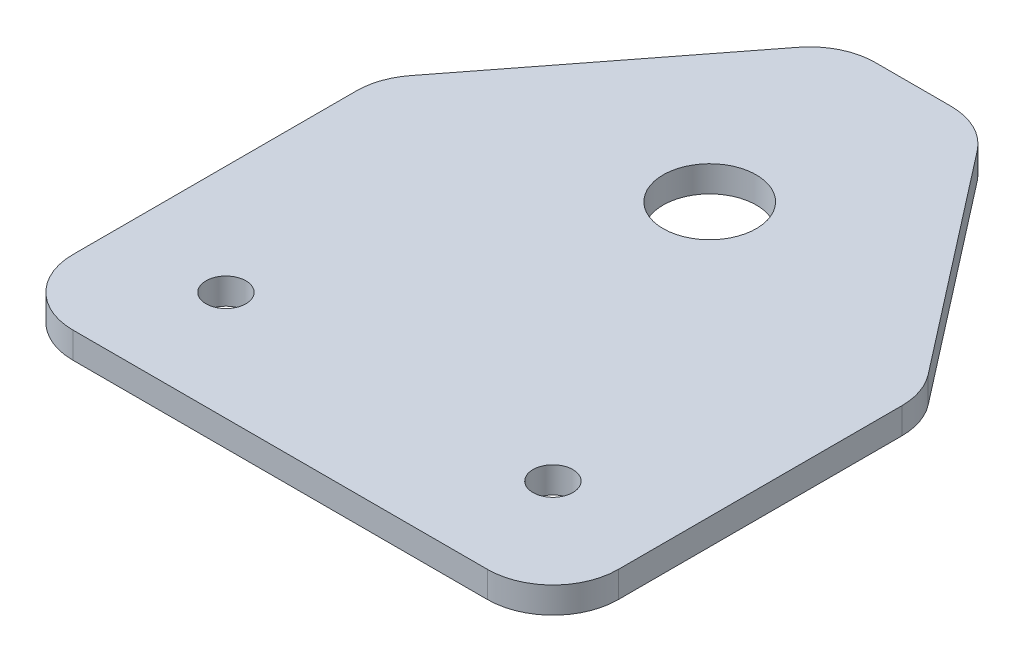
ISO-10303-21;
HEADER;
FILE_DESCRIPTION(('STEP AP214'),'2;1');
FILE_NAME('part.step','',(''),(''),'','','');
FILE_SCHEMA(('AUTOMOTIVE_DESIGN { 1 0 10303 214 1 1 1 1 }'));
ENDSEC;
DATA;
#1=APPLICATION_CONTEXT('core data for automotive mechanical design processes');
#2=APPLICATION_PROTOCOL_DEFINITION('international standard','automotive_design',2000,#1);
#3=PRODUCT_CONTEXT('',#1,'mechanical');
#4=PRODUCT('Part','Part','',(#3));
#5=PRODUCT_RELATED_PRODUCT_CATEGORY('part','',(#4));
#6=PRODUCT_DEFINITION_FORMATION('','',#4);
#7=PRODUCT_DEFINITION_CONTEXT('part definition',#1,'design');
#8=PRODUCT_DEFINITION('design','',#6,#7);
#9=PRODUCT_DEFINITION_SHAPE('','',#8);
#10=(LENGTH_UNIT() NAMED_UNIT(*) SI_UNIT(.MILLI.,.METRE.));
#11=(NAMED_UNIT(*) PLANE_ANGLE_UNIT() SI_UNIT($,.RADIAN.));
#12=(NAMED_UNIT(*) SI_UNIT($,.STERADIAN.) SOLID_ANGLE_UNIT());
#13=UNCERTAINTY_MEASURE_WITH_UNIT(LENGTH_MEASURE(1.E-05),#10,'distance_accuracy_value','');
#14=(GEOMETRIC_REPRESENTATION_CONTEXT(3) GLOBAL_UNCERTAINTY_ASSIGNED_CONTEXT((#13)) GLOBAL_UNIT_ASSIGNED_CONTEXT((#10,
#11,#12)) REPRESENTATION_CONTEXT('',''));
#15=CARTESIAN_POINT('',(0.,0.,0.));
#16=DIRECTION('',(0.,0.,1.));
#17=DIRECTION('',(1.,0.,0.));
#18=AXIS2_PLACEMENT_3D('',#15,#16,#17);
#19=CARTESIAN_POINT('',(31.7,4.,55.679690495143));
#20=DIRECTION('',(0.,-1.,0.));
#21=DIRECTION('',(0.,0.,-1.));
#22=AXIS2_PLACEMENT_3D('',#19,#20,#21);
#23=PLANE('',#22);
#24=CARTESIAN_POINT('',(31.7,4.,55.679690495143));
#25=DIRECTION('',(0.,1.,0.));
#26=DIRECTION('',(0.,0.,-1.));
#27=AXIS2_PLACEMENT_3D('',#24,#25,#26);
#28=CIRCLE('',#27,10.);
#29=CARTESIAN_POINT('',(31.6999999999999,4.,65.679690495143));
#30=VERTEX_POINT('',#29);
#31=CARTESIAN_POINT('',(41.7,4.,55.6796904951429));
#32=VERTEX_POINT('',#31);
#33=EDGE_CURVE('E183',#30,#32,#28,.T.);
#34=ORIENTED_EDGE('',*,*,#33,.T.);
#35=DIRECTION('',(0.,0.,-1.));
#36=VECTOR('',#35,1.);
#37=CARTESIAN_POINT('',(41.7,4.,55.6796904951429));
#38=LINE('',#37,#36);
#39=CARTESIAN_POINT('',(41.7,4.,12.3228381438996));
#40=VERTEX_POINT('',#39);
#41=EDGE_CURVE('E111',#32,#40,#38,.T.);
#42=ORIENTED_EDGE('',*,*,#41,.T.);
#43=CARTESIAN_POINT('',(31.7,4.,12.3228381438995));
#44=DIRECTION('',(0.,1.,0.));
#45=DIRECTION('',(0.,0.,1.));
#46=AXIS2_PLACEMENT_3D('',#43,#44,#45);
#47=CIRCLE('',#46,10.);
#48=CARTESIAN_POINT('',(39.6025672713628,4.,6.19507913088469));
#49=VERTEX_POINT('',#48);
#50=EDGE_CURVE('E210',#40,#49,#47,.T.);
#51=ORIENTED_EDGE('',*,*,#50,.T.);
#52=DIRECTION('',(-0.612775901301482,0.,-0.790256727136288));
#53=VECTOR('',#52,1.);
#54=CARTESIAN_POINT('',(39.6025672713628,4.,6.19507913088468));
#55=LINE('',#54,#53);
#56=CARTESIAN_POINT('',(13.6860403195468,4.,-27.2277590130148));
#57=VERTEX_POINT('',#56);
#58=EDGE_CURVE('E229',#49,#57,#55,.T.);
#59=ORIENTED_EDGE('',*,*,#58,.T.);
#60=CARTESIAN_POINT('',(5.7834730481839,4.,-21.1));
#61=DIRECTION('',(0.,1.,0.));
#62=DIRECTION('',(0.,0.,1.));
#63=AXIS2_PLACEMENT_3D('',#60,#61,#62);
#64=CIRCLE('',#63,10.);
#65=CARTESIAN_POINT('',(5.78347304818386,4.,-31.1));
#66=VERTEX_POINT('',#65);
#67=EDGE_CURVE('E226',#57,#66,#64,.T.);
#68=ORIENTED_EDGE('',*,*,#67,.T.);
#69=DIRECTION('',(-1.,0.,0.));
#70=VECTOR('',#69,1.);
#71=CARTESIAN_POINT('',(-5.78347304818386,4.,-31.1));
#72=LINE('',#71,#70);
#73=CARTESIAN_POINT('',(-5.78347304818386,4.,-31.1));
#74=VERTEX_POINT('',#73);
#75=EDGE_CURVE('E228',#66,#74,#72,.T.);
#76=ORIENTED_EDGE('',*,*,#75,.T.);
#77=CARTESIAN_POINT('',(-5.7834730481839,4.,-21.1));
#78=DIRECTION('',(0.,1.,0.));
#79=DIRECTION('',(0.,0.,1.));
#80=AXIS2_PLACEMENT_3D('',#77,#78,#79);
#81=CIRCLE('',#80,10.);
#82=CARTESIAN_POINT('',(-13.6860403195468,4.,-27.2277590130148));
#83=VERTEX_POINT('',#82);
#84=EDGE_CURVE('E231',#74,#83,#81,.T.);
#85=ORIENTED_EDGE('',*,*,#84,.T.);
#86=DIRECTION('',(-0.612775901301482,0.,0.790256727136288));
#87=VECTOR('',#86,1.);
#88=CARTESIAN_POINT('',(-39.6025672713628,4.,6.19507913088468));
#89=LINE('',#88,#87);
#90=CARTESIAN_POINT('',(-39.6025672713628,4.,6.19507913088468));
#91=VERTEX_POINT('',#90);
#92=EDGE_CURVE('E237',#83,#91,#89,.T.);
#93=ORIENTED_EDGE('',*,*,#92,.T.);
#94=CARTESIAN_POINT('',(-31.7,4.,12.3228381438995));
#95=DIRECTION('',(0.,1.,0.));
#96=DIRECTION('',(0.,0.,-1.));
#97=AXIS2_PLACEMENT_3D('',#94,#95,#96);
#98=CIRCLE('',#97,10.);
#99=CARTESIAN_POINT('',(-41.7,4.,12.3228381438996));
#100=VERTEX_POINT('',#99);
#101=EDGE_CURVE('E142',#91,#100,#98,.T.);
#102=ORIENTED_EDGE('',*,*,#101,.T.);
#103=DIRECTION('',(0.,0.,1.));
#104=VECTOR('',#103,1.);
#105=CARTESIAN_POINT('',(-41.7,4.,55.6796904951429));
#106=LINE('',#105,#104);
#107=CARTESIAN_POINT('',(-41.7,4.,55.6796904951429));
#108=VERTEX_POINT('',#107);
#109=EDGE_CURVE('E136',#100,#108,#106,.T.);
#110=ORIENTED_EDGE('',*,*,#109,.T.);
#111=CARTESIAN_POINT('',(-31.7,4.,55.679690495143));
#112=DIRECTION('',(0.,1.,0.));
#113=DIRECTION('',(0.,0.,-1.));
#114=AXIS2_PLACEMENT_3D('',#111,#112,#113);
#115=CIRCLE('',#114,10.);
#116=CARTESIAN_POINT('',(-31.6999999999999,4.,65.679690495143));
#117=VERTEX_POINT('',#116);
#118=EDGE_CURVE('E140',#108,#117,#115,.T.);
#119=ORIENTED_EDGE('',*,*,#118,.T.);
#120=DIRECTION('',(1.,0.,0.));
#121=VECTOR('',#120,1.);
#122=CARTESIAN_POINT('',(-31.6999999999999,4.,65.679690495143));
#123=LINE('',#122,#121);
#124=EDGE_CURVE('E56',#117,#30,#123,.T.);
#125=ORIENTED_EDGE('',*,*,#124,.T.);
#126=EDGE_LOOP('',(#34,#42,#51,#59,#68,#76,#85,#93,#102,#110,#119,#125));
#127=FACE_BOUND('',#126,.T.);
#128=CARTESIAN_POINT('',(0.,4.,0.));
#129=DIRECTION('',(0.,1.,0.));
#130=DIRECTION('',(0.,0.,1.));
#131=AXIS2_PLACEMENT_3D('',#128,#129,#130);
#132=CIRCLE('',#131,7.125);
#133=CARTESIAN_POINT('',(0.,4.,7.125));
#134=VERTEX_POINT('',#133);
#135=EDGE_CURVE('E164',#134,#134,#132,.T.);
#136=ORIENTED_EDGE('',*,*,#135,.F.);
#137=EDGE_LOOP('',(#136));
#138=FACE_BOUND('',#137,.T.);
#139=CARTESIAN_POINT('',(-25.,4.,48.979690495143));
#140=DIRECTION('',(0.,1.,0.));
#141=DIRECTION('',(0.,0.,1.));
#142=AXIS2_PLACEMENT_3D('',#139,#140,#141);
#143=CIRCLE('',#142,3.05);
#144=CARTESIAN_POINT('',(-25.,4.,52.029690495143));
#145=VERTEX_POINT('',#144);
#146=EDGE_CURVE('E291',#145,#145,#143,.T.);
#147=ORIENTED_EDGE('',*,*,#146,.F.);
#148=EDGE_LOOP('',(#147));
#149=FACE_BOUND('',#148,.T.);
#150=CARTESIAN_POINT('',(25.,4.,48.979690495143));
#151=DIRECTION('',(0.,1.,0.));
#152=DIRECTION('',(0.,0.,1.));
#153=AXIS2_PLACEMENT_3D('',#150,#151,#152);
#154=CIRCLE('',#153,3.05);
#155=CARTESIAN_POINT('',(25.,4.,52.029690495143));
#156=VERTEX_POINT('',#155);
#157=EDGE_CURVE('E282',#156,#156,#154,.T.);
#158=ORIENTED_EDGE('',*,*,#157,.F.);
#159=EDGE_LOOP('',(#158));
#160=FACE_BOUND('',#159,.T.);
#161=ADVANCED_FACE('F39',(#127,#138,#149,#160),#23,.F.);
#162=CARTESIAN_POINT('',(31.7,0.,55.679690495143));
#163=DIRECTION('',(0.,-1.,0.));
#164=DIRECTION('',(0.,0.,-1.));
#165=AXIS2_PLACEMENT_3D('',#162,#163,#164);
#166=PLANE('',#165);
#167=CARTESIAN_POINT('',(-25.,0.,48.979690495143));
#168=DIRECTION('',(0.,1.,0.));
#169=DIRECTION('',(0.,0.,1.));
#170=AXIS2_PLACEMENT_3D('',#167,#168,#169);
#171=CIRCLE('',#170,3.05);
#172=CARTESIAN_POINT('',(-25.,0.,52.029690495143));
#173=VERTEX_POINT('',#172);
#174=EDGE_CURVE('E288',#173,#173,#171,.T.);
#175=ORIENTED_EDGE('',*,*,#174,.T.);
#176=EDGE_LOOP('',(#175));
#177=FACE_BOUND('',#176,.T.);
#178=CARTESIAN_POINT('',(31.7,0.,55.679690495143));
#179=DIRECTION('',(0.,1.,0.));
#180=DIRECTION('',(0.,0.,-1.));
#181=AXIS2_PLACEMENT_3D('',#178,#179,#180);
#182=CIRCLE('',#181,10.);
#183=CARTESIAN_POINT('',(31.6999999999999,0.,65.679690495143));
#184=VERTEX_POINT('',#183);
#185=CARTESIAN_POINT('',(41.7,0.,55.6796904951429));
#186=VERTEX_POINT('',#185);
#187=EDGE_CURVE('E160',#184,#186,#182,.T.);
#188=ORIENTED_EDGE('',*,*,#187,.F.);
#189=DIRECTION('',(1.,0.,0.));
#190=VECTOR('',#189,1.);
#191=CARTESIAN_POINT('',(-31.6999999999999,0.,65.679690495143));
#192=LINE('',#191,#190);
#193=CARTESIAN_POINT('',(-31.6999999999999,0.,65.679690495143));
#194=VERTEX_POINT('',#193);
#195=EDGE_CURVE('E103',#194,#184,#192,.T.);
#196=ORIENTED_EDGE('',*,*,#195,.F.);
#197=CARTESIAN_POINT('',(-31.7,0.,55.679690495143));
#198=DIRECTION('',(0.,1.,0.));
#199=DIRECTION('',(0.,0.,-1.));
#200=AXIS2_PLACEMENT_3D('',#197,#198,#199);
#201=CIRCLE('',#200,10.);
#202=CARTESIAN_POINT('',(-41.7,0.,55.6796904951429));
#203=VERTEX_POINT('',#202);
#204=EDGE_CURVE('E97',#203,#194,#201,.T.);
#205=ORIENTED_EDGE('',*,*,#204,.F.);
#206=DIRECTION('',(0.,0.,1.));
#207=VECTOR('',#206,1.);
#208=CARTESIAN_POINT('',(-41.7,0.,55.6796904951429));
#209=LINE('',#208,#207);
#210=CARTESIAN_POINT('',(-41.7,0.,12.3228381438996));
#211=VERTEX_POINT('',#210);
#212=EDGE_CURVE('E150',#211,#203,#209,.T.);
#213=ORIENTED_EDGE('',*,*,#212,.F.);
#214=CARTESIAN_POINT('',(-31.7,0.,12.3228381438995));
#215=DIRECTION('',(0.,1.,0.));
#216=DIRECTION('',(0.,0.,-1.));
#217=AXIS2_PLACEMENT_3D('',#214,#215,#216);
#218=CIRCLE('',#217,10.);
#219=CARTESIAN_POINT('',(-39.6025672713628,0.,6.19507913088468));
#220=VERTEX_POINT('',#219);
#221=EDGE_CURVE('E178',#220,#211,#218,.T.);
#222=ORIENTED_EDGE('',*,*,#221,.F.);
#223=DIRECTION('',(-0.612775901301482,0.,0.790256727136288));
#224=VECTOR('',#223,1.);
#225=CARTESIAN_POINT('',(-39.6025672713628,0.,6.19507913088468));
#226=LINE('',#225,#224);
#227=CARTESIAN_POINT('',(-13.6860403195468,0.,-27.2277590130148));
#228=VERTEX_POINT('',#227);
#229=EDGE_CURVE('E176',#228,#220,#226,.T.);
#230=ORIENTED_EDGE('',*,*,#229,.F.);
#231=CARTESIAN_POINT('',(-5.7834730481839,0.,-21.1));
#232=DIRECTION('',(0.,1.,0.));
#233=DIRECTION('',(0.,0.,1.));
#234=AXIS2_PLACEMENT_3D('',#231,#232,#233);
#235=CIRCLE('',#234,10.);
#236=CARTESIAN_POINT('',(-5.78347304818386,0.,-31.1));
#237=VERTEX_POINT('',#236);
#238=EDGE_CURVE('E174',#237,#228,#235,.T.);
#239=ORIENTED_EDGE('',*,*,#238,.F.);
#240=DIRECTION('',(-1.,0.,0.));
#241=VECTOR('',#240,1.);
#242=CARTESIAN_POINT('',(-5.78347304818386,0.,-31.1));
#243=LINE('',#242,#241);
#244=CARTESIAN_POINT('',(5.78347304818386,0.,-31.1));
#245=VERTEX_POINT('',#244);
#246=EDGE_CURVE('E172',#245,#237,#243,.T.);
#247=ORIENTED_EDGE('',*,*,#246,.F.);
#248=CARTESIAN_POINT('',(5.7834730481839,0.,-21.1));
#249=DIRECTION('',(0.,1.,0.));
#250=DIRECTION('',(0.,0.,1.));
#251=AXIS2_PLACEMENT_3D('',#248,#249,#250);
#252=CIRCLE('',#251,10.);
#253=CARTESIAN_POINT('',(13.6860403195468,0.,-27.2277590130148));
#254=VERTEX_POINT('',#253);
#255=EDGE_CURVE('E170',#254,#245,#252,.T.);
#256=ORIENTED_EDGE('',*,*,#255,.F.);
#257=DIRECTION('',(-0.612775901301482,0.,-0.790256727136288));
#258=VECTOR('',#257,1.);
#259=CARTESIAN_POINT('',(39.6025672713628,0.,6.19507913088468));
#260=LINE('',#259,#258);
#261=CARTESIAN_POINT('',(39.6025672713628,0.,6.19507913088469));
#262=VERTEX_POINT('',#261);
#263=EDGE_CURVE('E168',#262,#254,#260,.T.);
#264=ORIENTED_EDGE('',*,*,#263,.F.);
#265=CARTESIAN_POINT('',(31.7,0.,12.3228381438995));
#266=DIRECTION('',(0.,1.,0.));
#267=DIRECTION('',(0.,0.,1.));
#268=AXIS2_PLACEMENT_3D('',#265,#266,#267);
#269=CIRCLE('',#268,10.);
#270=CARTESIAN_POINT('',(41.7,0.,12.3228381438996));
#271=VERTEX_POINT('',#270);
#272=EDGE_CURVE('E166',#271,#262,#269,.T.);
#273=ORIENTED_EDGE('',*,*,#272,.F.);
#274=DIRECTION('',(0.,0.,-1.));
#275=VECTOR('',#274,1.);
#276=CARTESIAN_POINT('',(41.7,0.,55.6796904951429));
#277=LINE('',#276,#275);
#278=EDGE_CURVE('E163',#186,#271,#277,.T.);
#279=ORIENTED_EDGE('',*,*,#278,.F.);
#280=EDGE_LOOP('',(#188,#196,#205,#213,#222,#230,#239,#247,#256,#264,#273,#279));
#281=FACE_BOUND('',#280,.T.);
#282=CARTESIAN_POINT('',(0.,0.,0.));
#283=DIRECTION('',(0.,1.,0.));
#284=DIRECTION('',(0.,0.,1.));
#285=AXIS2_PLACEMENT_3D('',#282,#283,#284);
#286=CIRCLE('',#285,7.125);
#287=CARTESIAN_POINT('',(0.,0.,7.125));
#288=VERTEX_POINT('',#287);
#289=EDGE_CURVE('E294',#288,#288,#286,.T.);
#290=ORIENTED_EDGE('',*,*,#289,.T.);
#291=EDGE_LOOP('',(#290));
#292=FACE_BOUND('',#291,.T.);
#293=CARTESIAN_POINT('',(25.,0.,48.979690495143));
#294=DIRECTION('',(0.,1.,0.));
#295=DIRECTION('',(0.,0.,1.));
#296=AXIS2_PLACEMENT_3D('',#293,#294,#295);
#297=CIRCLE('',#296,3.05);
#298=CARTESIAN_POINT('',(25.,0.,52.029690495143));
#299=VERTEX_POINT('',#298);
#300=EDGE_CURVE('E285',#299,#299,#297,.T.);
#301=ORIENTED_EDGE('',*,*,#300,.T.);
#302=EDGE_LOOP('',(#301));
#303=FACE_BOUND('',#302,.T.);
#304=ADVANCED_FACE('F214',(#177,#281,#292,#303),#166,.T.);
#305=CARTESIAN_POINT('',(31.7,4.,55.679690495143));
#306=DIRECTION('',(0.,-1.,0.));
#307=DIRECTION('',(0.,0.,-1.));
#308=AXIS2_PLACEMENT_3D('',#305,#306,#307);
#309=CYLINDRICAL_SURFACE('',#308,10.);
#310=ORIENTED_EDGE('',*,*,#187,.T.);
#311=DIRECTION('',(0.,-1.,0.));
#312=VECTOR('',#311,1.);
#313=CARTESIAN_POINT('',(41.7,4.,55.6796904951429));
#314=LINE('',#313,#312);
#315=EDGE_CURVE('E11',#32,#186,#314,.T.);
#316=ORIENTED_EDGE('',*,*,#315,.F.);
#317=ORIENTED_EDGE('',*,*,#33,.F.);
#318=DIRECTION('',(0.,-1.,0.));
#319=VECTOR('',#318,1.);
#320=CARTESIAN_POINT('',(31.6999999999999,4.,65.679690495143));
#321=LINE('',#320,#319);
#322=EDGE_CURVE('E156',#30,#184,#321,.T.);
#323=ORIENTED_EDGE('',*,*,#322,.T.);
#324=EDGE_LOOP('',(#310,#316,#317,#323));
#325=FACE_BOUND('',#324,.T.);
#326=ADVANCED_FACE('F41',(#325),#309,.T.);
#327=CARTESIAN_POINT('',(41.7,4.,55.6796904951429));
#328=DIRECTION('',(-1.,0.,0.));
#329=DIRECTION('',(0.,0.,1.));
#330=AXIS2_PLACEMENT_3D('',#327,#328,#329);
#331=PLANE('',#330);
#332=ORIENTED_EDGE('',*,*,#278,.T.);
#333=DIRECTION('',(0.,-1.,0.));
#334=VECTOR('',#333,1.);
#335=CARTESIAN_POINT('',(41.7,4.,12.3228381438996));
#336=LINE('',#335,#334);
#337=EDGE_CURVE('E48',#40,#271,#336,.T.);
#338=ORIENTED_EDGE('',*,*,#337,.F.);
#339=ORIENTED_EDGE('',*,*,#41,.F.);
#340=ORIENTED_EDGE('',*,*,#315,.T.);
#341=EDGE_LOOP('',(#332,#338,#339,#340));
#342=FACE_BOUND('',#341,.T.);
#343=ADVANCED_FACE('F400',(#342),#331,.F.);
#344=CARTESIAN_POINT('',(31.7,4.,12.3228381438995));
#345=DIRECTION('',(0.,-1.,0.));
#346=DIRECTION('',(0.,0.,-1.));
#347=AXIS2_PLACEMENT_3D('',#344,#345,#346);
#348=CYLINDRICAL_SURFACE('',#347,10.);
#349=ORIENTED_EDGE('',*,*,#272,.T.);
#350=DIRECTION('',(0.,-1.,0.));
#351=VECTOR('',#350,1.);
#352=CARTESIAN_POINT('',(39.6025672713628,4.,6.19507913088469));
#353=LINE('',#352,#351);
#354=EDGE_CURVE('E202',#49,#262,#353,.T.);
#355=ORIENTED_EDGE('',*,*,#354,.F.);
#356=ORIENTED_EDGE('',*,*,#50,.F.);
#357=ORIENTED_EDGE('',*,*,#337,.T.);
#358=EDGE_LOOP('',(#349,#355,#356,#357));
#359=FACE_BOUND('',#358,.T.);
#360=ADVANCED_FACE('F208',(#359),#348,.T.);
#361=CARTESIAN_POINT('',(39.6025672713628,4.,6.19507913088468));
#362=DIRECTION('',(-0.790256727136288,0.,0.612775901301482));
#363=DIRECTION('',(0.612775901301482,0.,0.790256727136288));
#364=AXIS2_PLACEMENT_3D('',#361,#362,#363);
#365=PLANE('',#364);
#366=ORIENTED_EDGE('',*,*,#263,.T.);
#367=DIRECTION('',(0.,-1.,0.));
#368=VECTOR('',#367,1.);
#369=CARTESIAN_POINT('',(13.6860403195468,4.,-27.2277590130148));
#370=LINE('',#369,#368);
#371=EDGE_CURVE('E199',#57,#254,#370,.T.);
#372=ORIENTED_EDGE('',*,*,#371,.F.);
#373=ORIENTED_EDGE('',*,*,#58,.F.);
#374=ORIENTED_EDGE('',*,*,#354,.T.);
#375=EDGE_LOOP('',(#366,#372,#373,#374));
#376=FACE_BOUND('',#375,.T.);
#377=ADVANCED_FACE('F220',(#376),#365,.F.);
#378=CARTESIAN_POINT('',(5.7834730481839,4.,-21.1));
#379=DIRECTION('',(0.,-1.,0.));
#380=DIRECTION('',(0.,0.,-1.));
#381=AXIS2_PLACEMENT_3D('',#378,#379,#380);
#382=CYLINDRICAL_SURFACE('',#381,10.);
#383=ORIENTED_EDGE('',*,*,#255,.T.);
#384=DIRECTION('',(0.,-1.,0.));
#385=VECTOR('',#384,1.);
#386=CARTESIAN_POINT('',(5.78347304818386,4.,-31.1));
#387=LINE('',#386,#385);
#388=EDGE_CURVE('E196',#66,#245,#387,.T.);
#389=ORIENTED_EDGE('',*,*,#388,.F.);
#390=ORIENTED_EDGE('',*,*,#67,.F.);
#391=ORIENTED_EDGE('',*,*,#371,.T.);
#392=EDGE_LOOP('',(#383,#389,#390,#391));
#393=FACE_BOUND('',#392,.T.);
#394=ADVANCED_FACE('F224',(#393),#382,.T.);
#395=CARTESIAN_POINT('',(-5.78347304818386,4.,-31.1));
#396=DIRECTION('',(0.,0.,1.));
#397=DIRECTION('',(1.,0.,0.));
#398=AXIS2_PLACEMENT_3D('',#395,#396,#397);
#399=PLANE('',#398);
#400=ORIENTED_EDGE('',*,*,#246,.T.);
#401=DIRECTION('',(0.,-1.,0.));
#402=VECTOR('',#401,1.);
#403=CARTESIAN_POINT('',(-5.78347304818386,4.,-31.1));
#404=LINE('',#403,#402);
#405=EDGE_CURVE('E193',#74,#237,#404,.T.);
#406=ORIENTED_EDGE('',*,*,#405,.F.);
#407=ORIENTED_EDGE('',*,*,#75,.F.);
#408=ORIENTED_EDGE('',*,*,#388,.T.);
#409=EDGE_LOOP('',(#400,#406,#407,#408));
#410=FACE_BOUND('',#409,.T.);
#411=ADVANCED_FACE('F365',(#410),#399,.F.);
#412=CARTESIAN_POINT('',(-5.7834730481839,4.,-21.1));
#413=DIRECTION('',(0.,-1.,0.));
#414=DIRECTION('',(0.,0.,-1.));
#415=AXIS2_PLACEMENT_3D('',#412,#413,#414);
#416=CYLINDRICAL_SURFACE('',#415,10.);
#417=ORIENTED_EDGE('',*,*,#238,.T.);
#418=DIRECTION('',(0.,-1.,0.));
#419=VECTOR('',#418,1.);
#420=CARTESIAN_POINT('',(-13.6860403195468,4.,-27.2277590130148));
#421=LINE('',#420,#419);
#422=EDGE_CURVE('E190',#83,#228,#421,.T.);
#423=ORIENTED_EDGE('',*,*,#422,.F.);
#424=ORIENTED_EDGE('',*,*,#84,.F.);
#425=ORIENTED_EDGE('',*,*,#405,.T.);
#426=EDGE_LOOP('',(#417,#423,#424,#425));
#427=FACE_BOUND('',#426,.T.);
#428=ADVANCED_FACE('F356',(#427),#416,.T.);
#429=CARTESIAN_POINT('',(-39.6025672713628,4.,6.19507913088468));
#430=DIRECTION('',(0.790256727136288,0.,0.612775901301482));
#431=DIRECTION('',(0.612775901301482,0.,-0.790256727136288));
#432=AXIS2_PLACEMENT_3D('',#429,#430,#431);
#433=PLANE('',#432);
#434=ORIENTED_EDGE('',*,*,#229,.T.);
#435=DIRECTION('',(0.,-1.,0.));
#436=VECTOR('',#435,1.);
#437=CARTESIAN_POINT('',(-39.6025672713628,4.,6.19507913088468));
#438=LINE('',#437,#436);
#439=EDGE_CURVE('E187',#91,#220,#438,.T.);
#440=ORIENTED_EDGE('',*,*,#439,.F.);
#441=ORIENTED_EDGE('',*,*,#92,.F.);
#442=ORIENTED_EDGE('',*,*,#422,.T.);
#443=EDGE_LOOP('',(#434,#440,#441,#442));
#444=FACE_BOUND('',#443,.T.);
#445=ADVANCED_FACE('F243',(#444),#433,.F.);
#446=CARTESIAN_POINT('',(-31.7,4.,12.3228381438995));
#447=DIRECTION('',(0.,-1.,0.));
#448=DIRECTION('',(0.,0.,-1.));
#449=AXIS2_PLACEMENT_3D('',#446,#447,#448);
#450=CYLINDRICAL_SURFACE('',#449,10.);
#451=ORIENTED_EDGE('',*,*,#221,.T.);
#452=DIRECTION('',(0.,-1.,0.));
#453=VECTOR('',#452,1.);
#454=CARTESIAN_POINT('',(-41.7,4.,12.3228381438996));
#455=LINE('',#454,#453);
#456=EDGE_CURVE('E151',#100,#211,#455,.T.);
#457=ORIENTED_EDGE('',*,*,#456,.F.);
#458=ORIENTED_EDGE('',*,*,#101,.F.);
#459=ORIENTED_EDGE('',*,*,#439,.T.);
#460=EDGE_LOOP('',(#451,#457,#458,#459));
#461=FACE_BOUND('',#460,.T.);
#462=ADVANCED_FACE('F247',(#461),#450,.T.);
#463=CARTESIAN_POINT('',(-41.7,4.,55.6796904951429));
#464=DIRECTION('',(1.,0.,0.));
#465=DIRECTION('',(0.,0.,-1.));
#466=AXIS2_PLACEMENT_3D('',#463,#464,#465);
#467=PLANE('',#466);
#468=ORIENTED_EDGE('',*,*,#212,.T.);
#469=DIRECTION('',(0.,-1.,0.));
#470=VECTOR('',#469,1.);
#471=CARTESIAN_POINT('',(-41.7,4.,55.6796904951429));
#472=LINE('',#471,#470);
#473=EDGE_CURVE('E147',#108,#203,#472,.T.);
#474=ORIENTED_EDGE('',*,*,#473,.F.);
#475=ORIENTED_EDGE('',*,*,#109,.F.);
#476=ORIENTED_EDGE('',*,*,#456,.T.);
#477=EDGE_LOOP('',(#468,#474,#475,#476));
#478=FACE_BOUND('',#477,.T.);
#479=ADVANCED_FACE('F148',(#478),#467,.F.);
#480=CARTESIAN_POINT('',(-31.7,4.,55.679690495143));
#481=DIRECTION('',(0.,-1.,0.));
#482=DIRECTION('',(0.,0.,-1.));
#483=AXIS2_PLACEMENT_3D('',#480,#481,#482);
#484=CYLINDRICAL_SURFACE('',#483,10.);
#485=ORIENTED_EDGE('',*,*,#204,.T.);
#486=DIRECTION('',(0.,-1.,0.));
#487=VECTOR('',#486,1.);
#488=CARTESIAN_POINT('',(-31.6999999999999,4.,65.679690495143));
#489=LINE('',#488,#487);
#490=EDGE_CURVE('E152',#117,#194,#489,.T.);
#491=ORIENTED_EDGE('',*,*,#490,.F.);
#492=ORIENTED_EDGE('',*,*,#118,.F.);
#493=ORIENTED_EDGE('',*,*,#473,.T.);
#494=EDGE_LOOP('',(#485,#491,#492,#493));
#495=FACE_BOUND('',#494,.T.);
#496=ADVANCED_FACE('F154',(#495),#484,.T.);
#497=CARTESIAN_POINT('',(-31.6999999999999,4.,65.679690495143));
#498=DIRECTION('',(0.,0.,-1.));
#499=DIRECTION('',(-1.,0.,0.));
#500=AXIS2_PLACEMENT_3D('',#497,#498,#499);
#501=PLANE('',#500);
#502=ORIENTED_EDGE('',*,*,#195,.T.);
#503=ORIENTED_EDGE('',*,*,#322,.F.);
#504=ORIENTED_EDGE('',*,*,#124,.F.);
#505=ORIENTED_EDGE('',*,*,#490,.T.);
#506=EDGE_LOOP('',(#502,#503,#504,#505));
#507=FACE_BOUND('',#506,.T.);
#508=ADVANCED_FACE('F251',(#507),#501,.F.);
#509=CARTESIAN_POINT('',(0.,4.,0.));
#510=DIRECTION('',(0.,-1.,0.));
#511=DIRECTION('',(0.,0.,-1.));
#512=AXIS2_PLACEMENT_3D('',#509,#510,#511);
#513=CYLINDRICAL_SURFACE('',#512,7.125);
#514=ORIENTED_EDGE('',*,*,#135,.T.);
#515=EDGE_LOOP('',(#514));
#516=FACE_BOUND('',#515,.T.);
#517=ORIENTED_EDGE('',*,*,#289,.F.);
#518=EDGE_LOOP('',(#517));
#519=FACE_BOUND('',#518,.T.);
#520=ADVANCED_FACE('F253',(#516,#519),#513,.F.);
#521=CARTESIAN_POINT('',(-25.,4.,48.979690495143));
#522=DIRECTION('',(0.,-1.,0.));
#523=DIRECTION('',(0.,0.,-1.));
#524=AXIS2_PLACEMENT_3D('',#521,#522,#523);
#525=CYLINDRICAL_SURFACE('',#524,3.05);
#526=ORIENTED_EDGE('',*,*,#146,.T.);
#527=EDGE_LOOP('',(#526));
#528=FACE_BOUND('',#527,.T.);
#529=ORIENTED_EDGE('',*,*,#174,.F.);
#530=EDGE_LOOP('',(#529));
#531=FACE_BOUND('',#530,.T.);
#532=ADVANCED_FACE('F259',(#528,#531),#525,.F.);
#533=CARTESIAN_POINT('',(25.,4.,48.979690495143));
#534=DIRECTION('',(0.,-1.,0.));
#535=DIRECTION('',(0.,0.,-1.));
#536=AXIS2_PLACEMENT_3D('',#533,#534,#535);
#537=CYLINDRICAL_SURFACE('',#536,3.05);
#538=ORIENTED_EDGE('',*,*,#157,.T.);
#539=EDGE_LOOP('',(#538));
#540=FACE_BOUND('',#539,.T.);
#541=ORIENTED_EDGE('',*,*,#300,.F.);
#542=EDGE_LOOP('',(#541));
#543=FACE_BOUND('',#542,.T.);
#544=ADVANCED_FACE('F273',(#540,#543),#537,.F.);
#545=CLOSED_SHELL('',(#161,#304,#326,#343,#360,#377,#394,#411,#428,#445,#462,#479,#496,#508,
#520,#532,#544));
#546=MANIFOLD_SOLID_BREP('B2',#545);
#547=ADVANCED_BREP_SHAPE_REPRESENTATION('',(#18,#546),#14);
#548=SHAPE_DEFINITION_REPRESENTATION(#9,#547);
ENDSEC;
END-ISO-10303-21;
